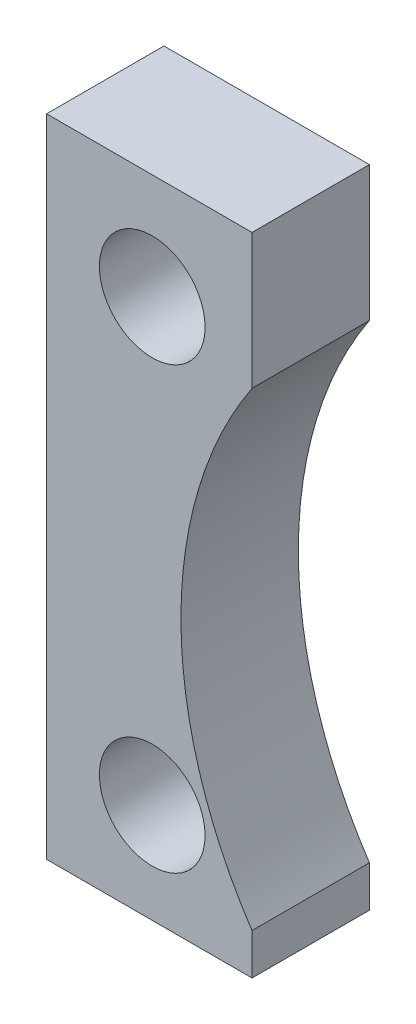
ISO-10303-21;
HEADER;
FILE_DESCRIPTION(('STEP AP214'),'2;1');
FILE_NAME('part.step','',(''),(''),'','','');
FILE_SCHEMA(('AUTOMOTIVE_DESIGN { 1 0 10303 214 1 1 1 1 }'));
ENDSEC;
DATA;
#1=APPLICATION_CONTEXT('core data for automotive mechanical design processes');
#2=APPLICATION_PROTOCOL_DEFINITION('international standard','automotive_design',2000,#1);
#3=PRODUCT_CONTEXT('',#1,'mechanical');
#4=PRODUCT('Part','Part','',(#3));
#5=PRODUCT_RELATED_PRODUCT_CATEGORY('part','',(#4));
#6=PRODUCT_DEFINITION_FORMATION('','',#4);
#7=PRODUCT_DEFINITION_CONTEXT('part definition',#1,'design');
#8=PRODUCT_DEFINITION('design','',#6,#7);
#9=PRODUCT_DEFINITION_SHAPE('','',#8);
#10=(LENGTH_UNIT() NAMED_UNIT(*) SI_UNIT(.MILLI.,.METRE.));
#11=(NAMED_UNIT(*) PLANE_ANGLE_UNIT() SI_UNIT($,.RADIAN.));
#12=(NAMED_UNIT(*) SI_UNIT($,.STERADIAN.) SOLID_ANGLE_UNIT());
#13=UNCERTAINTY_MEASURE_WITH_UNIT(LENGTH_MEASURE(1.E-05),#10,'distance_accuracy_value','');
#14=(GEOMETRIC_REPRESENTATION_CONTEXT(3) GLOBAL_UNCERTAINTY_ASSIGNED_CONTEXT((#13)) GLOBAL_UNIT_ASSIGNED_CONTEXT((#10,
#11,#12)) REPRESENTATION_CONTEXT('',''));
#15=CARTESIAN_POINT('',(0.,0.,0.));
#16=DIRECTION('',(0.,0.,1.));
#17=DIRECTION('',(1.,0.,0.));
#18=AXIS2_PLACEMENT_3D('',#15,#16,#17);
#19=CARTESIAN_POINT('',(0.,110.,10.));
#20=DIRECTION('',(1.,0.,0.));
#21=DIRECTION('',(0.,1.,0.));
#22=AXIS2_PLACEMENT_3D('',#19,#20,#21);
#23=PLANE('',#22);
#24=DIRECTION('',(0.,-1.,0.));
#25=VECTOR('',#24,1.);
#26=CARTESIAN_POINT('',(0.,110.,-10.));
#27=LINE('',#26,#25);
#28=CARTESIAN_POINT('',(0.,110.,-10.));
#29=VERTEX_POINT('',#28);
#30=CARTESIAN_POINT('',(0.,0.,-10.));
#31=VERTEX_POINT('',#30);
#32=EDGE_CURVE('E121',#29,#31,#27,.T.);
#33=ORIENTED_EDGE('',*,*,#32,.T.);
#34=DIRECTION('',(0.,0.,-1.));
#35=VECTOR('',#34,1.);
#36=CARTESIAN_POINT('',(0.,0.,10.));
#37=LINE('',#36,#35);
#38=CARTESIAN_POINT('',(0.,0.,10.));
#39=VERTEX_POINT('',#38);
#40=EDGE_CURVE('E11',#39,#31,#37,.T.);
#41=ORIENTED_EDGE('',*,*,#40,.F.);
#42=DIRECTION('',(0.,-1.,0.));
#43=VECTOR('',#42,1.);
#44=CARTESIAN_POINT('',(0.,110.,10.));
#45=LINE('',#44,#43);
#46=CARTESIAN_POINT('',(0.,110.,10.));
#47=VERTEX_POINT('',#46);
#48=EDGE_CURVE('E132',#47,#39,#45,.T.);
#49=ORIENTED_EDGE('',*,*,#48,.F.);
#50=DIRECTION('',(0.,0.,-1.));
#51=VECTOR('',#50,1.);
#52=CARTESIAN_POINT('',(0.,110.,10.));
#53=LINE('',#52,#51);
#54=EDGE_CURVE('E117',#47,#29,#53,.T.);
#55=ORIENTED_EDGE('',*,*,#54,.T.);
#56=EDGE_LOOP('',(#33,#41,#49,#55));
#57=FACE_BOUND('',#56,.T.);
#58=ADVANCED_FACE('F37',(#57),#23,.F.);
#59=CARTESIAN_POINT('',(0.,0.,10.));
#60=DIRECTION('',(0.,1.,0.));
#61=DIRECTION('',(0.,0.,1.));
#62=AXIS2_PLACEMENT_3D('',#59,#60,#61);
#63=PLANE('',#62);
#64=DIRECTION('',(1.,0.,0.));
#65=VECTOR('',#64,1.);
#66=CARTESIAN_POINT('',(0.,0.,-10.));
#67=LINE('',#66,#65);
#68=CARTESIAN_POINT('',(35.,0.,-10.));
#69=VERTEX_POINT('',#68);
#70=EDGE_CURVE('E124',#31,#69,#67,.T.);
#71=ORIENTED_EDGE('',*,*,#70,.T.);
#72=DIRECTION('',(0.,0.,-1.));
#73=VECTOR('',#72,1.);
#74=CARTESIAN_POINT('',(35.,0.,10.));
#75=LINE('',#74,#73);
#76=CARTESIAN_POINT('',(35.,0.,10.));
#77=VERTEX_POINT('',#76);
#78=EDGE_CURVE('E45',#77,#69,#75,.T.);
#79=ORIENTED_EDGE('',*,*,#78,.F.);
#80=DIRECTION('',(1.,0.,0.));
#81=VECTOR('',#80,1.);
#82=CARTESIAN_POINT('',(0.,0.,10.));
#83=LINE('',#82,#81);
#84=EDGE_CURVE('E90',#39,#77,#83,.T.);
#85=ORIENTED_EDGE('',*,*,#84,.F.);
#86=ORIENTED_EDGE('',*,*,#40,.T.);
#87=EDGE_LOOP('',(#71,#79,#85,#86));
#88=FACE_BOUND('',#87,.T.);
#89=ADVANCED_FACE('F157',(#88),#63,.F.);
#90=CARTESIAN_POINT('',(35.,7.,10.));
#91=DIRECTION('',(-1.,0.,0.));
#92=DIRECTION('',(0.,-1.,0.));
#93=AXIS2_PLACEMENT_3D('',#90,#91,#92);
#94=PLANE('',#93);
#95=DIRECTION('',(0.,1.,0.));
#96=VECTOR('',#95,1.);
#97=CARTESIAN_POINT('',(35.,7.,-10.));
#98=LINE('',#97,#96);
#99=CARTESIAN_POINT('',(35.,7.00000000000003,-10.));
#100=VERTEX_POINT('',#99);
#101=EDGE_CURVE('E127',#69,#100,#98,.T.);
#102=ORIENTED_EDGE('',*,*,#101,.T.);
#103=DIRECTION('',(0.,0.,-1.));
#104=VECTOR('',#103,1.);
#105=CARTESIAN_POINT('',(35.,7.00000000000003,10.));
#106=LINE('',#105,#104);
#107=CARTESIAN_POINT('',(35.,7.00000000000003,10.));
#108=VERTEX_POINT('',#107);
#109=EDGE_CURVE('E112',#108,#100,#106,.T.);
#110=ORIENTED_EDGE('',*,*,#109,.F.);
#111=DIRECTION('',(0.,1.,0.));
#112=VECTOR('',#111,1.);
#113=CARTESIAN_POINT('',(35.,7.,10.));
#114=LINE('',#113,#112);
#115=EDGE_CURVE('E103',#77,#108,#114,.T.);
#116=ORIENTED_EDGE('',*,*,#115,.F.);
#117=ORIENTED_EDGE('',*,*,#78,.T.);
#118=EDGE_LOOP('',(#102,#110,#116,#117));
#119=FACE_BOUND('',#118,.T.);
#120=ADVANCED_FACE('F138',(#119),#94,.F.);
#121=CARTESIAN_POINT('',(95.0000000000002,47.,10.));
#122=DIRECTION('',(0.,0.,-1.));
#123=DIRECTION('',(-1.,0.,0.));
#124=AXIS2_PLACEMENT_3D('',#121,#122,#123);
#125=CYLINDRICAL_SURFACE('',#124,72.11102550928);
#126=CARTESIAN_POINT('',(95.0000000000002,47.,-10.));
#127=DIRECTION('',(0.,0.,-1.));
#128=DIRECTION('',(1.,0.,0.));
#129=AXIS2_PLACEMENT_3D('',#126,#127,#128);
#130=CIRCLE('',#129,72.11102550928);
#131=CARTESIAN_POINT('',(35.,87.,-10.));
#132=VERTEX_POINT('',#131);
#133=EDGE_CURVE('E111',#100,#132,#130,.T.);
#134=ORIENTED_EDGE('',*,*,#133,.T.);
#135=DIRECTION('',(0.,0.,-1.));
#136=VECTOR('',#135,1.);
#137=CARTESIAN_POINT('',(35.,87.,10.));
#138=LINE('',#137,#136);
#139=CARTESIAN_POINT('',(35.,87.,10.));
#140=VERTEX_POINT('',#139);
#141=EDGE_CURVE('E108',#140,#132,#138,.T.);
#142=ORIENTED_EDGE('',*,*,#141,.F.);
#143=CARTESIAN_POINT('',(95.0000000000002,47.,10.));
#144=DIRECTION('',(0.,0.,-1.));
#145=DIRECTION('',(1.,0.,0.));
#146=AXIS2_PLACEMENT_3D('',#143,#144,#145);
#147=CIRCLE('',#146,72.11102550928);
#148=EDGE_CURVE('E97',#108,#140,#147,.T.);
#149=ORIENTED_EDGE('',*,*,#148,.F.);
#150=ORIENTED_EDGE('',*,*,#109,.T.);
#151=EDGE_LOOP('',(#134,#142,#149,#150));
#152=FACE_BOUND('',#151,.T.);
#153=ADVANCED_FACE('F109',(#152),#125,.F.);
#154=CARTESIAN_POINT('',(35.,110.,10.));
#155=DIRECTION('',(-1.,0.,0.));
#156=DIRECTION('',(0.,0.,1.));
#157=AXIS2_PLACEMENT_3D('',#154,#155,#156);
#158=PLANE('',#157);
#159=DIRECTION('',(0.,1.,0.));
#160=VECTOR('',#159,1.);
#161=CARTESIAN_POINT('',(35.,110.,-10.));
#162=LINE('',#161,#160);
#163=CARTESIAN_POINT('',(35.,110.,-10.));
#164=VERTEX_POINT('',#163);
#165=EDGE_CURVE('E76',#132,#164,#162,.T.);
#166=ORIENTED_EDGE('',*,*,#165,.T.);
#167=DIRECTION('',(0.,0.,-1.));
#168=VECTOR('',#167,1.);
#169=CARTESIAN_POINT('',(35.,110.,10.));
#170=LINE('',#169,#168);
#171=CARTESIAN_POINT('',(35.,110.,10.));
#172=VERTEX_POINT('',#171);
#173=EDGE_CURVE('E113',#172,#164,#170,.T.);
#174=ORIENTED_EDGE('',*,*,#173,.F.);
#175=DIRECTION('',(0.,1.,0.));
#176=VECTOR('',#175,1.);
#177=CARTESIAN_POINT('',(35.,110.,10.));
#178=LINE('',#177,#176);
#179=EDGE_CURVE('E101',#140,#172,#178,.T.);
#180=ORIENTED_EDGE('',*,*,#179,.F.);
#181=ORIENTED_EDGE('',*,*,#141,.T.);
#182=EDGE_LOOP('',(#166,#174,#180,#181));
#183=FACE_BOUND('',#182,.T.);
#184=ADVANCED_FACE('F115',(#183),#158,.F.);
#185=CARTESIAN_POINT('',(0.,110.,10.));
#186=DIRECTION('',(0.,-1.,0.));
#187=DIRECTION('',(0.,0.,-1.));
#188=AXIS2_PLACEMENT_3D('',#185,#186,#187);
#189=PLANE('',#188);
#190=DIRECTION('',(-1.,0.,0.));
#191=VECTOR('',#190,1.);
#192=CARTESIAN_POINT('',(0.,110.,-10.));
#193=LINE('',#192,#191);
#194=EDGE_CURVE('E82',#164,#29,#193,.T.);
#195=ORIENTED_EDGE('',*,*,#194,.T.);
#196=ORIENTED_EDGE('',*,*,#54,.F.);
#197=DIRECTION('',(-1.,0.,0.));
#198=VECTOR('',#197,1.);
#199=CARTESIAN_POINT('',(0.,110.,10.));
#200=LINE('',#199,#198);
#201=EDGE_CURVE('E53',#172,#47,#200,.T.);
#202=ORIENTED_EDGE('',*,*,#201,.F.);
#203=ORIENTED_EDGE('',*,*,#173,.T.);
#204=EDGE_LOOP('',(#195,#196,#202,#203));
#205=FACE_BOUND('',#204,.T.);
#206=ADVANCED_FACE('F145',(#205),#189,.F.);
#207=CARTESIAN_POINT('',(95.0000000000002,47.,10.));
#208=DIRECTION('',(0.,0.,1.));
#209=DIRECTION('',(1.,0.,0.));
#210=AXIS2_PLACEMENT_3D('',#207,#208,#209);
#211=PLANE('',#210);
#212=CARTESIAN_POINT('',(18.0000000000002,92.,10.));
#213=DIRECTION('',(0.,0.,1.));
#214=DIRECTION('',(1.,0.,0.));
#215=AXIS2_PLACEMENT_3D('',#212,#213,#214);
#216=CIRCLE('',#215,9.00000000000001);
#217=CARTESIAN_POINT('',(27.0000000000002,92.,10.));
#218=VERTEX_POINT('',#217);
#219=EDGE_CURVE('E222',#218,#218,#216,.T.);
#220=ORIENTED_EDGE('',*,*,#219,.F.);
#221=EDGE_LOOP('',(#220));
#222=FACE_BOUND('',#221,.T.);
#223=CARTESIAN_POINT('',(18.0000000000002,17.,10.));
#224=DIRECTION('',(0.,0.,1.));
#225=DIRECTION('',(1.,0.,0.));
#226=AXIS2_PLACEMENT_3D('',#223,#224,#225);
#227=CIRCLE('',#226,9.);
#228=CARTESIAN_POINT('',(27.0000000000002,17.,10.));
#229=VERTEX_POINT('',#228);
#230=EDGE_CURVE('E227',#229,#229,#227,.T.);
#231=ORIENTED_EDGE('',*,*,#230,.F.);
#232=EDGE_LOOP('',(#231));
#233=FACE_BOUND('',#232,.T.);
#234=ORIENTED_EDGE('',*,*,#48,.T.);
#235=ORIENTED_EDGE('',*,*,#84,.T.);
#236=ORIENTED_EDGE('',*,*,#115,.T.);
#237=ORIENTED_EDGE('',*,*,#148,.T.);
#238=ORIENTED_EDGE('',*,*,#179,.T.);
#239=ORIENTED_EDGE('',*,*,#201,.T.);
#240=EDGE_LOOP('',(#234,#235,#236,#237,#238,#239));
#241=FACE_BOUND('',#240,.T.);
#242=ADVANCED_FACE('F99',(#222,#233,#241),#211,.T.);
#243=CARTESIAN_POINT('',(95.0000000000002,47.,-10.));
#244=DIRECTION('',(0.,0.,1.));
#245=DIRECTION('',(1.,0.,0.));
#246=AXIS2_PLACEMENT_3D('',#243,#244,#245);
#247=PLANE('',#246);
#248=CARTESIAN_POINT('',(18.0000000000002,92.,-10.));
#249=DIRECTION('',(0.,0.,1.));
#250=DIRECTION('',(1.,0.,0.));
#251=AXIS2_PLACEMENT_3D('',#248,#249,#250);
#252=CIRCLE('',#251,9.00000000000001);
#253=CARTESIAN_POINT('',(27.0000000000002,92.,-10.));
#254=VERTEX_POINT('',#253);
#255=EDGE_CURVE('E125',#254,#254,#252,.T.);
#256=ORIENTED_EDGE('',*,*,#255,.T.);
#257=EDGE_LOOP('',(#256));
#258=FACE_BOUND('',#257,.T.);
#259=CARTESIAN_POINT('',(18.0000000000002,17.,-10.));
#260=DIRECTION('',(0.,0.,1.));
#261=DIRECTION('',(1.,0.,0.));
#262=AXIS2_PLACEMENT_3D('',#259,#260,#261);
#263=CIRCLE('',#262,9.);
#264=CARTESIAN_POINT('',(27.0000000000002,17.,-10.));
#265=VERTEX_POINT('',#264);
#266=EDGE_CURVE('E223',#265,#265,#263,.T.);
#267=ORIENTED_EDGE('',*,*,#266,.T.);
#268=EDGE_LOOP('',(#267));
#269=FACE_BOUND('',#268,.T.);
#270=ORIENTED_EDGE('',*,*,#32,.F.);
#271=ORIENTED_EDGE('',*,*,#194,.F.);
#272=ORIENTED_EDGE('',*,*,#165,.F.);
#273=ORIENTED_EDGE('',*,*,#133,.F.);
#274=ORIENTED_EDGE('',*,*,#101,.F.);
#275=ORIENTED_EDGE('',*,*,#70,.F.);
#276=EDGE_LOOP('',(#270,#271,#272,#273,#274,#275));
#277=FACE_BOUND('',#276,.T.);
#278=ADVANCED_FACE('F141',(#258,#269,#277),#247,.F.);
#279=CARTESIAN_POINT('',(18.0000000000002,17.,-10.));
#280=DIRECTION('',(0.,0.,1.));
#281=DIRECTION('',(1.,0.,0.));
#282=AXIS2_PLACEMENT_3D('',#279,#280,#281);
#283=CYLINDRICAL_SURFACE('',#282,9.);
#284=ORIENTED_EDGE('',*,*,#266,.F.);
#285=EDGE_LOOP('',(#284));
#286=FACE_BOUND('',#285,.T.);
#287=ORIENTED_EDGE('',*,*,#230,.T.);
#288=EDGE_LOOP('',(#287));
#289=FACE_BOUND('',#288,.T.);
#290=ADVANCED_FACE('F194',(#286,#289),#283,.F.);
#291=CARTESIAN_POINT('',(18.0000000000002,92.,-10.));
#292=DIRECTION('',(0.,0.,1.));
#293=DIRECTION('',(1.,0.,0.));
#294=AXIS2_PLACEMENT_3D('',#291,#292,#293);
#295=CYLINDRICAL_SURFACE('',#294,9.00000000000001);
#296=ORIENTED_EDGE('',*,*,#255,.F.);
#297=EDGE_LOOP('',(#296));
#298=FACE_BOUND('',#297,.T.);
#299=ORIENTED_EDGE('',*,*,#219,.T.);
#300=EDGE_LOOP('',(#299));
#301=FACE_BOUND('',#300,.T.);
#302=ADVANCED_FACE('F203',(#298,#301),#295,.F.);
#303=CLOSED_SHELL('',(#58,#89,#120,#153,#184,#206,#242,#278,#290,#302));
#304=MANIFOLD_SOLID_BREP('B2',#303);
#305=ADVANCED_BREP_SHAPE_REPRESENTATION('',(#18,#304),#14);
#306=SHAPE_DEFINITION_REPRESENTATION(#9,#305);
ENDSEC;
END-ISO-10303-21;
